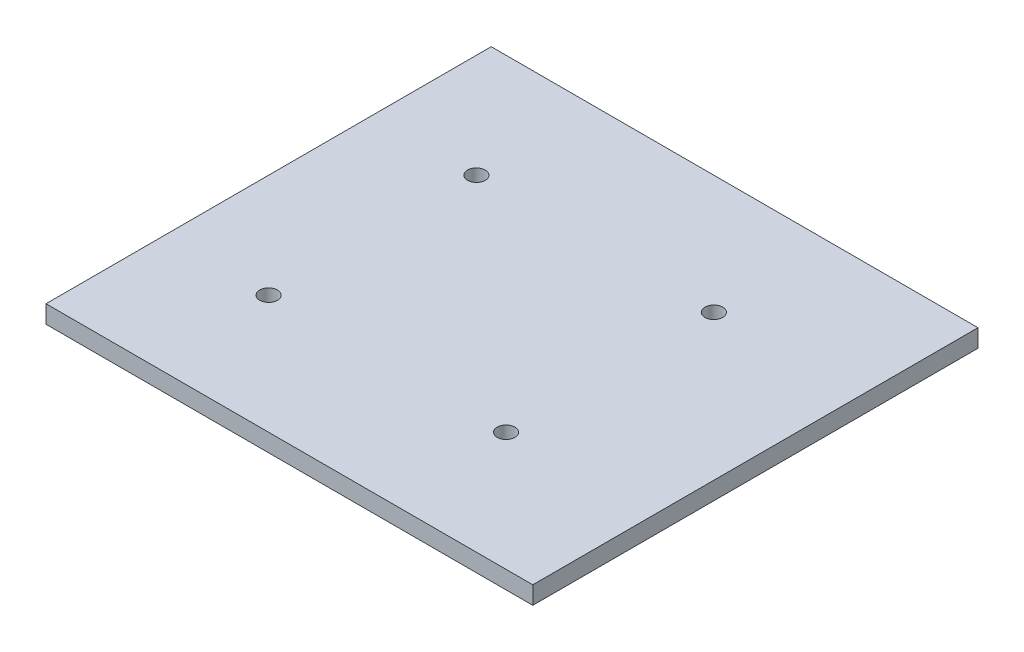
ISO-10303-21;
HEADER;
FILE_DESCRIPTION(('STEP AP214'),'2;1');
FILE_NAME('part.step','',(''),(''),'','','');
FILE_SCHEMA(('AUTOMOTIVE_DESIGN { 1 0 10303 214 1 1 1 1 }'));
ENDSEC;
DATA;
#1=APPLICATION_CONTEXT('core data for automotive mechanical design processes');
#2=APPLICATION_PROTOCOL_DEFINITION('international standard','automotive_design',2000,#1);
#3=PRODUCT_CONTEXT('',#1,'mechanical');
#4=PRODUCT('Part','Part','',(#3));
#5=PRODUCT_RELATED_PRODUCT_CATEGORY('part','',(#4));
#6=PRODUCT_DEFINITION_FORMATION('','',#4);
#7=PRODUCT_DEFINITION_CONTEXT('part definition',#1,'design');
#8=PRODUCT_DEFINITION('design','',#6,#7);
#9=PRODUCT_DEFINITION_SHAPE('','',#8);
#10=(LENGTH_UNIT() NAMED_UNIT(*) SI_UNIT(.MILLI.,.METRE.));
#11=(NAMED_UNIT(*) PLANE_ANGLE_UNIT() SI_UNIT($,.RADIAN.));
#12=(NAMED_UNIT(*) SI_UNIT($,.STERADIAN.) SOLID_ANGLE_UNIT());
#13=UNCERTAINTY_MEASURE_WITH_UNIT(LENGTH_MEASURE(1.E-05),#10,'distance_accuracy_value','');
#14=(GEOMETRIC_REPRESENTATION_CONTEXT(3) GLOBAL_UNCERTAINTY_ASSIGNED_CONTEXT((#13)) GLOBAL_UNIT_ASSIGNED_CONTEXT((#10,
#11,#12)) REPRESENTATION_CONTEXT('',''));
#15=CARTESIAN_POINT('',(0.,0.,0.));
#16=DIRECTION('',(0.,0.,1.));
#17=DIRECTION('',(1.,0.,0.));
#18=AXIS2_PLACEMENT_3D('',#15,#16,#17);
#19=CARTESIAN_POINT('',(0.,3.,0.));
#20=DIRECTION('',(1.,0.,0.));
#21=DIRECTION('',(0.,0.,-1.));
#22=AXIS2_PLACEMENT_3D('',#19,#20,#21);
#23=PLANE('',#22);
#24=DIRECTION('',(0.,0.,1.));
#25=VECTOR('',#24,1.);
#26=CARTESIAN_POINT('',(0.,0.,0.));
#27=LINE('',#26,#25);
#28=CARTESIAN_POINT('',(0.,0.,-75.));
#29=VERTEX_POINT('',#28);
#30=CARTESIAN_POINT('',(0.,0.,0.));
#31=VERTEX_POINT('',#30);
#32=EDGE_CURVE('E102',#29,#31,#27,.T.);
#33=ORIENTED_EDGE('',*,*,#32,.T.);
#34=DIRECTION('',(0.,-1.,0.));
#35=VECTOR('',#34,1.);
#36=CARTESIAN_POINT('',(0.,3.,0.));
#37=LINE('',#36,#35);
#38=CARTESIAN_POINT('',(0.,3.,0.));
#39=VERTEX_POINT('',#38);
#40=EDGE_CURVE('E11',#39,#31,#37,.T.);
#41=ORIENTED_EDGE('',*,*,#40,.F.);
#42=DIRECTION('',(0.,0.,1.));
#43=VECTOR('',#42,1.);
#44=CARTESIAN_POINT('',(0.,3.,0.));
#45=LINE('',#44,#43);
#46=CARTESIAN_POINT('',(0.,3.,-75.));
#47=VERTEX_POINT('',#46);
#48=EDGE_CURVE('E90',#47,#39,#45,.T.);
#49=ORIENTED_EDGE('',*,*,#48,.F.);
#50=DIRECTION('',(0.,-1.,0.));
#51=VECTOR('',#50,1.);
#52=CARTESIAN_POINT('',(0.,3.,-75.));
#53=LINE('',#52,#51);
#54=EDGE_CURVE('E98',#47,#29,#53,.T.);
#55=ORIENTED_EDGE('',*,*,#54,.T.);
#56=EDGE_LOOP('',(#33,#41,#49,#55));
#57=FACE_BOUND('',#56,.T.);
#58=ADVANCED_FACE('F39',(#57),#23,.F.);
#59=CARTESIAN_POINT('',(0.,3.,0.));
#60=DIRECTION('',(0.,0.,-1.));
#61=DIRECTION('',(-1.,0.,0.));
#62=AXIS2_PLACEMENT_3D('',#59,#60,#61);
#63=PLANE('',#62);
#64=DIRECTION('',(1.,0.,0.));
#65=VECTOR('',#64,1.);
#66=CARTESIAN_POINT('',(0.,0.,0.));
#67=LINE('',#66,#65);
#68=CARTESIAN_POINT('',(82.,0.,0.));
#69=VERTEX_POINT('',#68);
#70=EDGE_CURVE('E94',#31,#69,#67,.T.);
#71=ORIENTED_EDGE('',*,*,#70,.T.);
#72=DIRECTION('',(0.,-1.,0.));
#73=VECTOR('',#72,1.);
#74=CARTESIAN_POINT('',(82.,3.,0.));
#75=LINE('',#74,#73);
#76=CARTESIAN_POINT('',(82.,3.,0.));
#77=VERTEX_POINT('',#76);
#78=EDGE_CURVE('E47',#77,#69,#75,.T.);
#79=ORIENTED_EDGE('',*,*,#78,.F.);
#80=DIRECTION('',(1.,0.,0.));
#81=VECTOR('',#80,1.);
#82=CARTESIAN_POINT('',(0.,3.,0.));
#83=LINE('',#82,#81);
#84=EDGE_CURVE('E85',#39,#77,#83,.T.);
#85=ORIENTED_EDGE('',*,*,#84,.F.);
#86=ORIENTED_EDGE('',*,*,#40,.T.);
#87=EDGE_LOOP('',(#71,#79,#85,#86));
#88=FACE_BOUND('',#87,.T.);
#89=ADVANCED_FACE('F93',(#88),#63,.F.);
#90=CARTESIAN_POINT('',(82.,3.,0.));
#91=DIRECTION('',(-1.,0.,0.));
#92=DIRECTION('',(0.,0.,1.));
#93=AXIS2_PLACEMENT_3D('',#90,#91,#92);
#94=PLANE('',#93);
#95=DIRECTION('',(0.,0.,-1.));
#96=VECTOR('',#95,1.);
#97=CARTESIAN_POINT('',(82.,0.,0.));
#98=LINE('',#97,#96);
#99=CARTESIAN_POINT('',(82.,0.,-75.));
#100=VERTEX_POINT('',#99);
#101=EDGE_CURVE('E72',#69,#100,#98,.T.);
#102=ORIENTED_EDGE('',*,*,#101,.T.);
#103=DIRECTION('',(0.,-1.,0.));
#104=VECTOR('',#103,1.);
#105=CARTESIAN_POINT('',(82.,3.,-75.));
#106=LINE('',#105,#104);
#107=CARTESIAN_POINT('',(82.,3.,-75.));
#108=VERTEX_POINT('',#107);
#109=EDGE_CURVE('E95',#108,#100,#106,.T.);
#110=ORIENTED_EDGE('',*,*,#109,.F.);
#111=DIRECTION('',(0.,0.,-1.));
#112=VECTOR('',#111,1.);
#113=CARTESIAN_POINT('',(82.,3.,0.));
#114=LINE('',#113,#112);
#115=EDGE_CURVE('E88',#77,#108,#114,.T.);
#116=ORIENTED_EDGE('',*,*,#115,.F.);
#117=ORIENTED_EDGE('',*,*,#78,.T.);
#118=EDGE_LOOP('',(#102,#110,#116,#117));
#119=FACE_BOUND('',#118,.T.);
#120=ADVANCED_FACE('F96',(#119),#94,.F.);
#121=CARTESIAN_POINT('',(0.,3.,-75.));
#122=DIRECTION('',(0.,0.,1.));
#123=DIRECTION('',(1.,0.,0.));
#124=AXIS2_PLACEMENT_3D('',#121,#122,#123);
#125=PLANE('',#124);
#126=DIRECTION('',(-1.,0.,0.));
#127=VECTOR('',#126,1.);
#128=CARTESIAN_POINT('',(0.,0.,-75.));
#129=LINE('',#128,#127);
#130=EDGE_CURVE('E78',#100,#29,#129,.T.);
#131=ORIENTED_EDGE('',*,*,#130,.T.);
#132=ORIENTED_EDGE('',*,*,#54,.F.);
#133=DIRECTION('',(-1.,0.,0.));
#134=VECTOR('',#133,1.);
#135=CARTESIAN_POINT('',(0.,3.,-75.));
#136=LINE('',#135,#134);
#137=EDGE_CURVE('E55',#108,#47,#136,.T.);
#138=ORIENTED_EDGE('',*,*,#137,.F.);
#139=ORIENTED_EDGE('',*,*,#109,.T.);
#140=EDGE_LOOP('',(#131,#132,#138,#139));
#141=FACE_BOUND('',#140,.T.);
#142=ADVANCED_FACE('F110',(#141),#125,.F.);
#143=CARTESIAN_POINT('',(0.,3.,0.));
#144=DIRECTION('',(0.,-1.,0.));
#145=DIRECTION('',(0.,0.,-1.));
#146=AXIS2_PLACEMENT_3D('',#143,#144,#145);
#147=PLANE('',#146);
#148=CARTESIAN_POINT('',(17.5,3.,-55.));
#149=DIRECTION('',(0.,1.,0.));
#150=DIRECTION('',(0.,0.,1.));
#151=AXIS2_PLACEMENT_3D('',#148,#149,#150);
#152=CIRCLE('',#151,1.5);
#153=CARTESIAN_POINT('',(17.5,3.,-53.5));
#154=VERTEX_POINT('',#153);
#155=EDGE_CURVE('E125',#154,#154,#152,.T.);
#156=ORIENTED_EDGE('',*,*,#155,.F.);
#157=EDGE_LOOP('',(#156));
#158=FACE_BOUND('',#157,.T.);
#159=CARTESIAN_POINT('',(57.5,3.,-20.));
#160=DIRECTION('',(0.,1.,0.));
#161=DIRECTION('',(0.,0.,1.));
#162=AXIS2_PLACEMENT_3D('',#159,#160,#161);
#163=CIRCLE('',#162,1.5);
#164=CARTESIAN_POINT('',(57.5,3.,-18.5));
#165=VERTEX_POINT('',#164);
#166=EDGE_CURVE('E131',#165,#165,#163,.T.);
#167=ORIENTED_EDGE('',*,*,#166,.F.);
#168=EDGE_LOOP('',(#167));
#169=FACE_BOUND('',#168,.T.);
#170=CARTESIAN_POINT('',(17.5,3.,-20.));
#171=DIRECTION('',(0.,1.,0.));
#172=DIRECTION('',(0.,0.,1.));
#173=AXIS2_PLACEMENT_3D('',#170,#171,#172);
#174=CIRCLE('',#173,1.5);
#175=CARTESIAN_POINT('',(17.5,3.,-18.5));
#176=VERTEX_POINT('',#175);
#177=EDGE_CURVE('E119',#176,#176,#174,.T.);
#178=ORIENTED_EDGE('',*,*,#177,.F.);
#179=EDGE_LOOP('',(#178));
#180=FACE_BOUND('',#179,.T.);
#181=CARTESIAN_POINT('',(57.5,3.,-55.));
#182=DIRECTION('',(0.,1.,0.));
#183=DIRECTION('',(0.,0.,1.));
#184=AXIS2_PLACEMENT_3D('',#181,#182,#183);
#185=CIRCLE('',#184,1.5);
#186=CARTESIAN_POINT('',(57.5,3.,-53.5));
#187=VERTEX_POINT('',#186);
#188=EDGE_CURVE('E116',#187,#187,#185,.T.);
#189=ORIENTED_EDGE('',*,*,#188,.F.);
#190=EDGE_LOOP('',(#189));
#191=FACE_BOUND('',#190,.T.);
#192=ORIENTED_EDGE('',*,*,#48,.T.);
#193=ORIENTED_EDGE('',*,*,#84,.T.);
#194=ORIENTED_EDGE('',*,*,#115,.T.);
#195=ORIENTED_EDGE('',*,*,#137,.T.);
#196=EDGE_LOOP('',(#192,#193,#194,#195));
#197=FACE_BOUND('',#196,.T.);
#198=ADVANCED_FACE('F86',(#158,#169,#180,#191,#197),#147,.F.);
#199=CARTESIAN_POINT('',(0.,0.,0.));
#200=DIRECTION('',(0.,-1.,0.));
#201=DIRECTION('',(0.,0.,-1.));
#202=AXIS2_PLACEMENT_3D('',#199,#200,#201);
#203=PLANE('',#202);
#204=CARTESIAN_POINT('',(17.5,0.,-55.));
#205=DIRECTION('',(0.,1.,0.));
#206=DIRECTION('',(0.,0.,1.));
#207=AXIS2_PLACEMENT_3D('',#204,#205,#206);
#208=CIRCLE('',#207,1.5);
#209=CARTESIAN_POINT('',(17.5,0.,-53.5));
#210=VERTEX_POINT('',#209);
#211=EDGE_CURVE('E122',#210,#210,#208,.T.);
#212=ORIENTED_EDGE('',*,*,#211,.T.);
#213=EDGE_LOOP('',(#212));
#214=FACE_BOUND('',#213,.T.);
#215=CARTESIAN_POINT('',(57.5,0.,-20.));
#216=DIRECTION('',(0.,1.,0.));
#217=DIRECTION('',(0.,0.,1.));
#218=AXIS2_PLACEMENT_3D('',#215,#216,#217);
#219=CIRCLE('',#218,1.5);
#220=CARTESIAN_POINT('',(57.5,0.,-18.5));
#221=VERTEX_POINT('',#220);
#222=EDGE_CURVE('E128',#221,#221,#219,.T.);
#223=ORIENTED_EDGE('',*,*,#222,.T.);
#224=EDGE_LOOP('',(#223));
#225=FACE_BOUND('',#224,.T.);
#226=CARTESIAN_POINT('',(17.5,0.,-20.));
#227=DIRECTION('',(0.,1.,0.));
#228=DIRECTION('',(0.,0.,1.));
#229=AXIS2_PLACEMENT_3D('',#226,#227,#228);
#230=CIRCLE('',#229,1.5);
#231=CARTESIAN_POINT('',(17.5,0.,-18.5));
#232=VERTEX_POINT('',#231);
#233=EDGE_CURVE('E134',#232,#232,#230,.T.);
#234=ORIENTED_EDGE('',*,*,#233,.T.);
#235=EDGE_LOOP('',(#234));
#236=FACE_BOUND('',#235,.T.);
#237=CARTESIAN_POINT('',(57.5,0.,-55.));
#238=DIRECTION('',(0.,1.,0.));
#239=DIRECTION('',(0.,0.,1.));
#240=AXIS2_PLACEMENT_3D('',#237,#238,#239);
#241=CIRCLE('',#240,1.5);
#242=CARTESIAN_POINT('',(57.5,0.,-53.5));
#243=VERTEX_POINT('',#242);
#244=EDGE_CURVE('E105',#243,#243,#241,.T.);
#245=ORIENTED_EDGE('',*,*,#244,.T.);
#246=EDGE_LOOP('',(#245));
#247=FACE_BOUND('',#246,.T.);
#248=ORIENTED_EDGE('',*,*,#32,.F.);
#249=ORIENTED_EDGE('',*,*,#130,.F.);
#250=ORIENTED_EDGE('',*,*,#101,.F.);
#251=ORIENTED_EDGE('',*,*,#70,.F.);
#252=EDGE_LOOP('',(#248,#249,#250,#251));
#253=FACE_BOUND('',#252,.T.);
#254=ADVANCED_FACE('F113',(#214,#225,#236,#247,#253),#203,.T.);
#255=CARTESIAN_POINT('',(57.5,0.,-55.));
#256=DIRECTION('',(0.,1.,0.));
#257=DIRECTION('',(0.,0.,1.));
#258=AXIS2_PLACEMENT_3D('',#255,#256,#257);
#259=CYLINDRICAL_SURFACE('',#258,1.5);
#260=ORIENTED_EDGE('',*,*,#244,.F.);
#261=EDGE_LOOP('',(#260));
#262=FACE_BOUND('',#261,.T.);
#263=ORIENTED_EDGE('',*,*,#188,.T.);
#264=EDGE_LOOP('',(#263));
#265=FACE_BOUND('',#264,.T.);
#266=ADVANCED_FACE('F148',(#262,#265),#259,.F.);
#267=CARTESIAN_POINT('',(17.5,0.,-20.));
#268=DIRECTION('',(0.,1.,0.));
#269=DIRECTION('',(0.,0.,1.));
#270=AXIS2_PLACEMENT_3D('',#267,#268,#269);
#271=CYLINDRICAL_SURFACE('',#270,1.5);
#272=ORIENTED_EDGE('',*,*,#233,.F.);
#273=EDGE_LOOP('',(#272));
#274=FACE_BOUND('',#273,.T.);
#275=ORIENTED_EDGE('',*,*,#177,.T.);
#276=EDGE_LOOP('',(#275));
#277=FACE_BOUND('',#276,.T.);
#278=ADVANCED_FACE('F140',(#274,#277),#271,.F.);
#279=CARTESIAN_POINT('',(57.5,0.,-20.));
#280=DIRECTION('',(0.,1.,0.));
#281=DIRECTION('',(0.,0.,1.));
#282=AXIS2_PLACEMENT_3D('',#279,#280,#281);
#283=CYLINDRICAL_SURFACE('',#282,1.5);
#284=ORIENTED_EDGE('',*,*,#222,.F.);
#285=EDGE_LOOP('',(#284));
#286=FACE_BOUND('',#285,.T.);
#287=ORIENTED_EDGE('',*,*,#166,.T.);
#288=EDGE_LOOP('',(#287));
#289=FACE_BOUND('',#288,.T.);
#290=ADVANCED_FACE('F156',(#286,#289),#283,.F.);
#291=CARTESIAN_POINT('',(17.5,0.,-55.));
#292=DIRECTION('',(0.,1.,0.));
#293=DIRECTION('',(0.,0.,1.));
#294=AXIS2_PLACEMENT_3D('',#291,#292,#293);
#295=CYLINDRICAL_SURFACE('',#294,1.5);
#296=ORIENTED_EDGE('',*,*,#211,.F.);
#297=EDGE_LOOP('',(#296));
#298=FACE_BOUND('',#297,.T.);
#299=ORIENTED_EDGE('',*,*,#155,.T.);
#300=EDGE_LOOP('',(#299));
#301=FACE_BOUND('',#300,.T.);
#302=ADVANCED_FACE('F207',(#298,#301),#295,.F.);
#303=CLOSED_SHELL('',(#58,#89,#120,#142,#198,#254,#266,#278,#290,#302));
#304=MANIFOLD_SOLID_BREP('B2',#303);
#305=ADVANCED_BREP_SHAPE_REPRESENTATION('',(#18,#304),#14);
#306=SHAPE_DEFINITION_REPRESENTATION(#9,#305);
ENDSEC;
END-ISO-10303-21;
